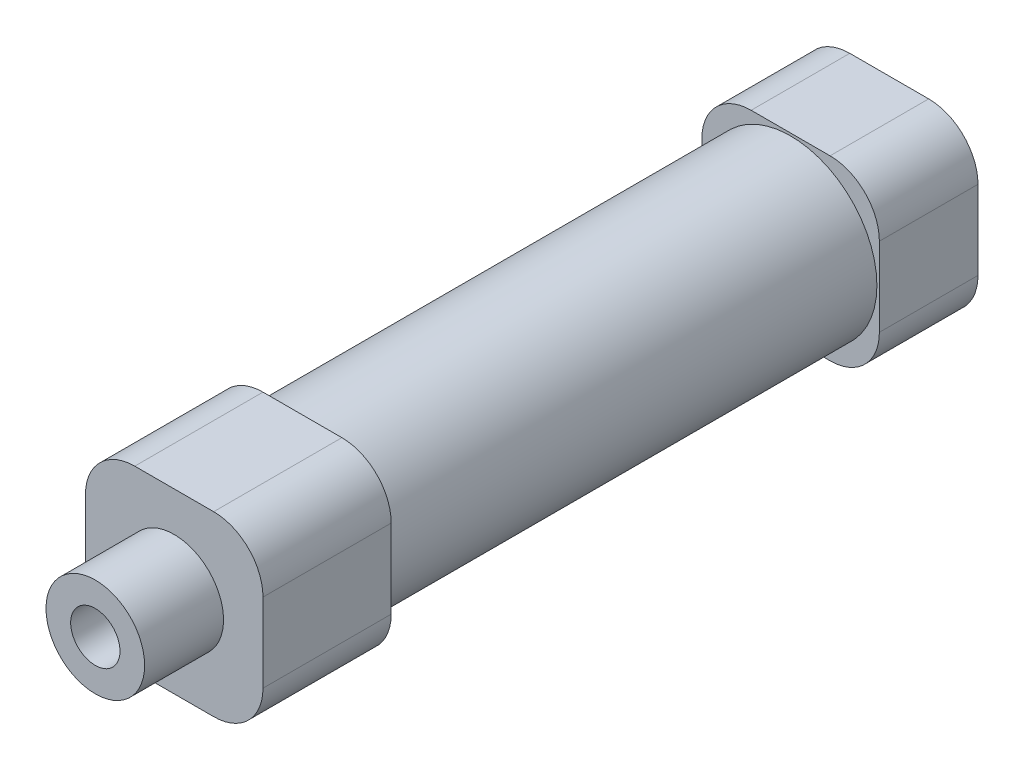
ISO-10303-21;
HEADER;
FILE_DESCRIPTION(('STEP AP214'),'2;1');
FILE_NAME('part.step','',(''),(''),'','','');
FILE_SCHEMA(('AUTOMOTIVE_DESIGN { 1 0 10303 214 1 1 1 1 }'));
ENDSEC;
DATA;
#1=APPLICATION_CONTEXT('core data for automotive mechanical design processes');
#2=APPLICATION_PROTOCOL_DEFINITION('international standard','automotive_design',2000,#1);
#3=PRODUCT_CONTEXT('',#1,'mechanical');
#4=PRODUCT('Part','Part','',(#3));
#5=PRODUCT_RELATED_PRODUCT_CATEGORY('part','',(#4));
#6=PRODUCT_DEFINITION_FORMATION('','',#4);
#7=PRODUCT_DEFINITION_CONTEXT('part definition',#1,'design');
#8=PRODUCT_DEFINITION('design','',#6,#7);
#9=PRODUCT_DEFINITION_SHAPE('','',#8);
#10=(LENGTH_UNIT() NAMED_UNIT(*) SI_UNIT(.MILLI.,.METRE.));
#11=(NAMED_UNIT(*) PLANE_ANGLE_UNIT() SI_UNIT($,.RADIAN.));
#12=(NAMED_UNIT(*) SI_UNIT($,.STERADIAN.) SOLID_ANGLE_UNIT());
#13=UNCERTAINTY_MEASURE_WITH_UNIT(LENGTH_MEASURE(1.E-05),#10,'distance_accuracy_value','');
#14=(GEOMETRIC_REPRESENTATION_CONTEXT(3) GLOBAL_UNCERTAINTY_ASSIGNED_CONTEXT((#13)) GLOBAL_UNIT_ASSIGNED_CONTEXT((#10,
#11,#12)) REPRESENTATION_CONTEXT('',''));
#15=CARTESIAN_POINT('',(0.,0.,0.));
#16=DIRECTION('',(0.,0.,1.));
#17=DIRECTION('',(1.,0.,0.));
#18=AXIS2_PLACEMENT_3D('',#15,#16,#17);
#19=CARTESIAN_POINT('',(0.,0.,72.5));
#20=DIRECTION('',(0.,0.,-1.));
#21=DIRECTION('',(-1.,0.,0.));
#22=AXIS2_PLACEMENT_3D('',#19,#20,#21);
#23=PLANE('',#22);
#24=DIRECTION('',(-1.,0.,0.));
#25=VECTOR('',#24,1.);
#26=CARTESIAN_POINT('',(-9.,9.,72.5));
#27=LINE('',#26,#25);
#28=CARTESIAN_POINT('',(4.,9.,72.5));
#29=VERTEX_POINT('',#28);
#30=CARTESIAN_POINT('',(-4.,9.,72.5));
#31=VERTEX_POINT('',#30);
#32=EDGE_CURVE('E191',#29,#31,#27,.T.);
#33=ORIENTED_EDGE('',*,*,#32,.T.);
#34=CARTESIAN_POINT('',(-4.,4.,72.5));
#35=DIRECTION('',(0.,0.,-1.));
#36=DIRECTION('',(-1.,0.,0.));
#37=AXIS2_PLACEMENT_3D('',#34,#35,#36);
#38=CIRCLE('',#37,5.);
#39=CARTESIAN_POINT('',(-9.,4.,72.5));
#40=VERTEX_POINT('',#39);
#41=EDGE_CURVE('E299',#31,#40,#38,.F.);
#42=ORIENTED_EDGE('',*,*,#41,.T.);
#43=DIRECTION('',(0.,-1.,0.));
#44=VECTOR('',#43,1.);
#45=CARTESIAN_POINT('',(-9.,-9.,72.5));
#46=LINE('',#45,#44);
#47=CARTESIAN_POINT('',(-9.,-4.,72.5));
#48=VERTEX_POINT('',#47);
#49=EDGE_CURVE('E195',#40,#48,#46,.T.);
#50=ORIENTED_EDGE('',*,*,#49,.T.);
#51=CARTESIAN_POINT('',(-4.,-4.,72.5));
#52=DIRECTION('',(0.,0.,-1.));
#53=DIRECTION('',(-1.,0.,0.));
#54=AXIS2_PLACEMENT_3D('',#51,#52,#53);
#55=CIRCLE('',#54,5.);
#56=CARTESIAN_POINT('',(-4.,-9.,72.5));
#57=VERTEX_POINT('',#56);
#58=EDGE_CURVE('E297',#48,#57,#55,.F.);
#59=ORIENTED_EDGE('',*,*,#58,.T.);
#60=DIRECTION('',(1.,0.,0.));
#61=VECTOR('',#60,1.);
#62=CARTESIAN_POINT('',(-9.,-9.,72.5));
#63=LINE('',#62,#61);
#64=CARTESIAN_POINT('',(4.,-9.,72.5));
#65=VERTEX_POINT('',#64);
#66=EDGE_CURVE('E198',#57,#65,#63,.T.);
#67=ORIENTED_EDGE('',*,*,#66,.T.);
#68=CARTESIAN_POINT('',(4.,-4.,72.5));
#69=DIRECTION('',(0.,0.,-1.));
#70=DIRECTION('',(-1.,0.,0.));
#71=AXIS2_PLACEMENT_3D('',#68,#69,#70);
#72=CIRCLE('',#71,5.);
#73=CARTESIAN_POINT('',(9.,-4.,72.5));
#74=VERTEX_POINT('',#73);
#75=EDGE_CURVE('E295',#65,#74,#72,.F.);
#76=ORIENTED_EDGE('',*,*,#75,.T.);
#77=DIRECTION('',(0.,1.,0.));
#78=VECTOR('',#77,1.);
#79=CARTESIAN_POINT('',(9.,-9.,72.5));
#80=LINE('',#79,#78);
#81=CARTESIAN_POINT('',(9.,4.,72.5));
#82=VERTEX_POINT('',#81);
#83=EDGE_CURVE('E188',#74,#82,#80,.T.);
#84=ORIENTED_EDGE('',*,*,#83,.T.);
#85=CARTESIAN_POINT('',(4.,4.,72.5));
#86=DIRECTION('',(0.,0.,-1.));
#87=DIRECTION('',(-1.,0.,0.));
#88=AXIS2_PLACEMENT_3D('',#85,#86,#87);
#89=CIRCLE('',#88,5.);
#90=EDGE_CURVE('E293',#82,#29,#89,.F.);
#91=ORIENTED_EDGE('',*,*,#90,.T.);
#92=EDGE_LOOP('',(#33,#42,#50,#59,#67,#76,#84,#91));
#93=FACE_BOUND('',#92,.T.);
#94=CARTESIAN_POINT('',(0.,0.,72.5));
#95=DIRECTION('',(0.,0.,-1.));
#96=DIRECTION('',(-1.,0.,0.));
#97=AXIS2_PLACEMENT_3D('',#94,#95,#96);
#98=CIRCLE('',#97,5.);
#99=CARTESIAN_POINT('',(-5.,0.,72.5));
#100=VERTEX_POINT('',#99);
#101=EDGE_CURVE('E231',#100,#100,#98,.F.);
#102=ORIENTED_EDGE('',*,*,#101,.F.);
#103=EDGE_LOOP('',(#102));
#104=FACE_BOUND('',#103,.T.);
#105=ADVANCED_FACE('F38',(#93,#104),#23,.F.);
#106=CARTESIAN_POINT('',(0.,0.,10.));
#107=DIRECTION('',(0.,0.,1.));
#108=DIRECTION('',(1.,0.,0.));
#109=AXIS2_PLACEMENT_3D('',#106,#107,#108);
#110=PLANE('',#109);
#111=DIRECTION('',(-1.,0.,0.));
#112=VECTOR('',#111,1.);
#113=CARTESIAN_POINT('',(-9.,9.,10.));
#114=LINE('',#113,#112);
#115=CARTESIAN_POINT('',(4.,9.,10.));
#116=VERTEX_POINT('',#115);
#117=CARTESIAN_POINT('',(-4.,9.,10.));
#118=VERTEX_POINT('',#117);
#119=EDGE_CURVE('E221',#116,#118,#114,.T.);
#120=ORIENTED_EDGE('',*,*,#119,.T.);
#121=CARTESIAN_POINT('',(-4.,4.,10.));
#122=DIRECTION('',(0.,0.,1.));
#123=DIRECTION('',(1.,0.,0.));
#124=AXIS2_PLACEMENT_3D('',#121,#122,#123);
#125=CIRCLE('',#124,5.);
#126=CARTESIAN_POINT('',(-9.,4.,10.));
#127=VERTEX_POINT('',#126);
#128=EDGE_CURVE('E268',#118,#127,#125,.T.);
#129=ORIENTED_EDGE('',*,*,#128,.T.);
#130=DIRECTION('',(0.,-1.,0.));
#131=VECTOR('',#130,1.);
#132=CARTESIAN_POINT('',(-9.,9.,10.));
#133=LINE('',#132,#131);
#134=CARTESIAN_POINT('',(-9.,-4.,10.));
#135=VERTEX_POINT('',#134);
#136=EDGE_CURVE('E225',#127,#135,#133,.T.);
#137=ORIENTED_EDGE('',*,*,#136,.T.);
#138=CARTESIAN_POINT('',(-4.,-4.,10.));
#139=DIRECTION('',(0.,0.,1.));
#140=DIRECTION('',(1.,0.,0.));
#141=AXIS2_PLACEMENT_3D('',#138,#139,#140);
#142=CIRCLE('',#141,5.);
#143=CARTESIAN_POINT('',(-4.,-9.,10.));
#144=VERTEX_POINT('',#143);
#145=EDGE_CURVE('E266',#135,#144,#142,.T.);
#146=ORIENTED_EDGE('',*,*,#145,.T.);
#147=DIRECTION('',(1.,0.,0.));
#148=VECTOR('',#147,1.);
#149=CARTESIAN_POINT('',(-9.,-9.,10.));
#150=LINE('',#149,#148);
#151=CARTESIAN_POINT('',(4.,-9.,10.));
#152=VERTEX_POINT('',#151);
#153=EDGE_CURVE('E228',#144,#152,#150,.T.);
#154=ORIENTED_EDGE('',*,*,#153,.T.);
#155=CARTESIAN_POINT('',(4.,-4.,10.));
#156=DIRECTION('',(0.,0.,1.));
#157=DIRECTION('',(1.,0.,0.));
#158=AXIS2_PLACEMENT_3D('',#155,#156,#157);
#159=CIRCLE('',#158,5.);
#160=CARTESIAN_POINT('',(9.,-4.,10.));
#161=VERTEX_POINT('',#160);
#162=EDGE_CURVE('E264',#152,#161,#159,.T.);
#163=ORIENTED_EDGE('',*,*,#162,.T.);
#164=DIRECTION('',(0.,1.,0.));
#165=VECTOR('',#164,1.);
#166=CARTESIAN_POINT('',(9.,9.,10.));
#167=LINE('',#166,#165);
#168=CARTESIAN_POINT('',(9.,4.,10.));
#169=VERTEX_POINT('',#168);
#170=EDGE_CURVE('E218',#161,#169,#167,.T.);
#171=ORIENTED_EDGE('',*,*,#170,.T.);
#172=CARTESIAN_POINT('',(4.,4.,10.));
#173=DIRECTION('',(0.,0.,1.));
#174=DIRECTION('',(1.,0.,0.));
#175=AXIS2_PLACEMENT_3D('',#172,#173,#174);
#176=CIRCLE('',#175,5.);
#177=EDGE_CURVE('E262',#169,#116,#176,.T.);
#178=ORIENTED_EDGE('',*,*,#177,.T.);
#179=EDGE_LOOP('',(#120,#129,#137,#146,#154,#163,#171,#178));
#180=FACE_BOUND('',#179,.T.);
#181=CARTESIAN_POINT('',(0.,0.,10.));
#182=DIRECTION('',(0.,0.,1.));
#183=DIRECTION('',(1.,0.,0.));
#184=AXIS2_PLACEMENT_3D('',#181,#182,#183);
#185=CIRCLE('',#184,8.75);
#186=CARTESIAN_POINT('',(8.74999999999999,0.,10.));
#187=VERTEX_POINT('',#186);
#188=EDGE_CURVE('E201',#187,#187,#185,.T.);
#189=ORIENTED_EDGE('',*,*,#188,.F.);
#190=EDGE_LOOP('',(#189));
#191=FACE_BOUND('',#190,.T.);
#192=ADVANCED_FACE('F369',(#180,#191),#110,.T.);
#193=CARTESIAN_POINT('',(9.,9.,10.));
#194=DIRECTION('',(-1.,0.,0.));
#195=DIRECTION('',(0.,-1.,0.));
#196=AXIS2_PLACEMENT_3D('',#193,#194,#195);
#197=PLANE('',#196);
#198=ORIENTED_EDGE('',*,*,#170,.F.);
#199=DIRECTION('',(0.,0.,-1.));
#200=VECTOR('',#199,1.);
#201=CARTESIAN_POINT('',(9.,-4.,10.));
#202=LINE('',#201,#200);
#203=CARTESIAN_POINT('',(9.,-4.,0.));
#204=VERTEX_POINT('',#203);
#205=EDGE_CURVE('E308',#161,#204,#202,.T.);
#206=ORIENTED_EDGE('',*,*,#205,.T.);
#207=DIRECTION('',(0.,1.,0.));
#208=VECTOR('',#207,1.);
#209=CARTESIAN_POINT('',(9.,9.,0.));
#210=LINE('',#209,#208);
#211=CARTESIAN_POINT('',(9.,4.,0.));
#212=VERTEX_POINT('',#211);
#213=EDGE_CURVE('E215',#204,#212,#210,.T.);
#214=ORIENTED_EDGE('',*,*,#213,.T.);
#215=DIRECTION('',(0.,0.,-1.));
#216=VECTOR('',#215,1.);
#217=CARTESIAN_POINT('',(9.,4.,10.));
#218=LINE('',#217,#216);
#219=EDGE_CURVE('E306',#212,#169,#218,.F.);
#220=ORIENTED_EDGE('',*,*,#219,.T.);
#221=EDGE_LOOP('',(#198,#206,#214,#220));
#222=FACE_BOUND('',#221,.T.);
#223=ADVANCED_FACE('F374',(#222),#197,.F.);
#224=CARTESIAN_POINT('',(-9.,9.,10.));
#225=DIRECTION('',(0.,-1.,0.));
#226=DIRECTION('',(0.,0.,-1.));
#227=AXIS2_PLACEMENT_3D('',#224,#225,#226);
#228=PLANE('',#227);
#229=DIRECTION('',(-1.,0.,0.));
#230=VECTOR('',#229,1.);
#231=CARTESIAN_POINT('',(-9.,9.,0.));
#232=LINE('',#231,#230);
#233=CARTESIAN_POINT('',(4.,9.,0.));
#234=VERTEX_POINT('',#233);
#235=CARTESIAN_POINT('',(-4.,9.,0.));
#236=VERTEX_POINT('',#235);
#237=EDGE_CURVE('E234',#234,#236,#232,.T.);
#238=ORIENTED_EDGE('',*,*,#237,.T.);
#239=DIRECTION('',(0.,0.,-1.));
#240=VECTOR('',#239,1.);
#241=CARTESIAN_POINT('',(-4.,9.,10.));
#242=LINE('',#241,#240);
#243=EDGE_CURVE('E260',#236,#118,#242,.F.);
#244=ORIENTED_EDGE('',*,*,#243,.T.);
#245=ORIENTED_EDGE('',*,*,#119,.F.);
#246=DIRECTION('',(0.,0.,-1.));
#247=VECTOR('',#246,1.);
#248=CARTESIAN_POINT('',(4.,9.,10.));
#249=LINE('',#248,#247);
#250=EDGE_CURVE('E257',#116,#234,#249,.T.);
#251=ORIENTED_EDGE('',*,*,#250,.T.);
#252=EDGE_LOOP('',(#238,#244,#245,#251));
#253=FACE_BOUND('',#252,.T.);
#254=ADVANCED_FACE('F407',(#253),#228,.F.);
#255=CARTESIAN_POINT('',(-9.,9.,10.));
#256=DIRECTION('',(1.,0.,0.));
#257=DIRECTION('',(0.,1.,0.));
#258=AXIS2_PLACEMENT_3D('',#255,#256,#257);
#259=PLANE('',#258);
#260=ORIENTED_EDGE('',*,*,#136,.F.);
#261=DIRECTION('',(0.,0.,-1.));
#262=VECTOR('',#261,1.);
#263=CARTESIAN_POINT('',(-9.,4.,10.));
#264=LINE('',#263,#262);
#265=CARTESIAN_POINT('',(-9.,4.,0.));
#266=VERTEX_POINT('',#265);
#267=EDGE_CURVE('E246',#127,#266,#264,.T.);
#268=ORIENTED_EDGE('',*,*,#267,.T.);
#269=DIRECTION('',(0.,-1.,0.));
#270=VECTOR('',#269,1.);
#271=CARTESIAN_POINT('',(-9.,9.,0.));
#272=LINE('',#271,#270);
#273=CARTESIAN_POINT('',(-9.,-4.,0.));
#274=VERTEX_POINT('',#273);
#275=EDGE_CURVE('E237',#266,#274,#272,.T.);
#276=ORIENTED_EDGE('',*,*,#275,.T.);
#277=DIRECTION('',(0.,0.,-1.));
#278=VECTOR('',#277,1.);
#279=CARTESIAN_POINT('',(-9.,-4.,10.));
#280=LINE('',#279,#278);
#281=EDGE_CURVE('E244',#274,#135,#280,.F.);
#282=ORIENTED_EDGE('',*,*,#281,.T.);
#283=EDGE_LOOP('',(#260,#268,#276,#282));
#284=FACE_BOUND('',#283,.T.);
#285=ADVANCED_FACE('F403',(#284),#259,.F.);
#286=CARTESIAN_POINT('',(-9.,-9.,10.));
#287=DIRECTION('',(0.,1.,0.));
#288=DIRECTION('',(0.,0.,1.));
#289=AXIS2_PLACEMENT_3D('',#286,#287,#288);
#290=PLANE('',#289);
#291=CARTESIAN_POINT('',(0.,-9.,5.25));
#292=DIRECTION('',(0.,-1.,0.));
#293=DIRECTION('',(0.,0.,-1.));
#294=AXIS2_PLACEMENT_3D('',#291,#292,#293);
#295=CIRCLE('',#294,2.5);
#296=CARTESIAN_POINT('',(0.,-9.,2.75));
#297=VERTEX_POINT('',#296);
#298=EDGE_CURVE('E176',#297,#297,#295,.T.);
#299=ORIENTED_EDGE('',*,*,#298,.F.);
#300=EDGE_LOOP('',(#299));
#301=FACE_BOUND('',#300,.T.);
#302=ORIENTED_EDGE('',*,*,#153,.F.);
#303=DIRECTION('',(0.,0.,-1.));
#304=VECTOR('',#303,1.);
#305=CARTESIAN_POINT('',(-4.,-9.,10.));
#306=LINE('',#305,#304);
#307=CARTESIAN_POINT('',(-4.,-9.,0.));
#308=VERTEX_POINT('',#307);
#309=EDGE_CURVE('E272',#144,#308,#306,.T.);
#310=ORIENTED_EDGE('',*,*,#309,.T.);
#311=DIRECTION('',(1.,0.,0.));
#312=VECTOR('',#311,1.);
#313=CARTESIAN_POINT('',(-9.,-9.,0.));
#314=LINE('',#313,#312);
#315=CARTESIAN_POINT('',(4.,-9.,0.));
#316=VERTEX_POINT('',#315);
#317=EDGE_CURVE('E222',#308,#316,#314,.T.);
#318=ORIENTED_EDGE('',*,*,#317,.T.);
#319=DIRECTION('',(0.,0.,-1.));
#320=VECTOR('',#319,1.);
#321=CARTESIAN_POINT('',(4.,-9.,10.));
#322=LINE('',#321,#320);
#323=EDGE_CURVE('E270',#316,#152,#322,.F.);
#324=ORIENTED_EDGE('',*,*,#323,.T.);
#325=EDGE_LOOP('',(#302,#310,#318,#324));
#326=FACE_BOUND('',#325,.T.);
#327=ADVANCED_FACE('F399',(#301,#326),#290,.F.);
#328=CARTESIAN_POINT('',(0.,0.,0.));
#329=DIRECTION('',(0.,0.,1.));
#330=DIRECTION('',(1.,0.,0.));
#331=AXIS2_PLACEMENT_3D('',#328,#329,#330);
#332=PLANE('',#331);
#333=ORIENTED_EDGE('',*,*,#275,.F.);
#334=CARTESIAN_POINT('',(-4.,4.,0.));
#335=DIRECTION('',(0.,0.,1.));
#336=DIRECTION('',(1.,0.,0.));
#337=AXIS2_PLACEMENT_3D('',#334,#335,#336);
#338=CIRCLE('',#337,5.);
#339=EDGE_CURVE('E255',#266,#236,#338,.F.);
#340=ORIENTED_EDGE('',*,*,#339,.T.);
#341=ORIENTED_EDGE('',*,*,#237,.F.);
#342=CARTESIAN_POINT('',(4.,4.,0.));
#343=DIRECTION('',(0.,0.,1.));
#344=DIRECTION('',(1.,0.,0.));
#345=AXIS2_PLACEMENT_3D('',#342,#343,#344);
#346=CIRCLE('',#345,5.);
#347=EDGE_CURVE('E249',#234,#212,#346,.F.);
#348=ORIENTED_EDGE('',*,*,#347,.T.);
#349=ORIENTED_EDGE('',*,*,#213,.F.);
#350=CARTESIAN_POINT('',(4.,-4.,0.));
#351=DIRECTION('',(0.,0.,1.));
#352=DIRECTION('',(1.,0.,0.));
#353=AXIS2_PLACEMENT_3D('',#350,#351,#352);
#354=CIRCLE('',#353,5.);
#355=EDGE_CURVE('E251',#204,#316,#354,.F.);
#356=ORIENTED_EDGE('',*,*,#355,.T.);
#357=ORIENTED_EDGE('',*,*,#317,.F.);
#358=CARTESIAN_POINT('',(-4.,-4.,0.));
#359=DIRECTION('',(0.,0.,1.));
#360=DIRECTION('',(1.,0.,0.));
#361=AXIS2_PLACEMENT_3D('',#358,#359,#360);
#362=CIRCLE('',#361,5.);
#363=EDGE_CURVE('E253',#308,#274,#362,.F.);
#364=ORIENTED_EDGE('',*,*,#363,.T.);
#365=EDGE_LOOP('',(#333,#340,#341,#348,#349,#356,#357,#364));
#366=FACE_BOUND('',#365,.T.);
#367=ADVANCED_FACE('F394',(#366),#332,.F.);
#368=CARTESIAN_POINT('',(0.,0.,59.5));
#369=DIRECTION('',(0.,0.,-1.));
#370=DIRECTION('',(-1.,0.,0.));
#371=AXIS2_PLACEMENT_3D('',#368,#369,#370);
#372=CYLINDRICAL_SURFACE('',#371,8.75);
#373=CARTESIAN_POINT('',(0.,0.,59.5));
#374=DIRECTION('',(0.,0.,1.));
#375=DIRECTION('',(1.,0.,0.));
#376=AXIS2_PLACEMENT_3D('',#373,#374,#375);
#377=CIRCLE('',#376,8.75);
#378=CARTESIAN_POINT('',(8.74999999999999,0.,59.5));
#379=VERTEX_POINT('',#378);
#380=EDGE_CURVE('E212',#379,#379,#377,.T.);
#381=ORIENTED_EDGE('',*,*,#380,.F.);
#382=EDGE_LOOP('',(#381));
#383=FACE_BOUND('',#382,.T.);
#384=ORIENTED_EDGE('',*,*,#188,.T.);
#385=EDGE_LOOP('',(#384));
#386=FACE_BOUND('',#385,.T.);
#387=ADVANCED_FACE('F383',(#383,#386),#372,.T.);
#388=CARTESIAN_POINT('',(0.,0.,59.5));
#389=DIRECTION('',(0.,0.,-1.));
#390=DIRECTION('',(-1.,0.,0.));
#391=AXIS2_PLACEMENT_3D('',#388,#389,#390);
#392=PLANE('',#391);
#393=DIRECTION('',(0.,-1.,0.));
#394=VECTOR('',#393,1.);
#395=CARTESIAN_POINT('',(-9.,-9.,59.5));
#396=LINE('',#395,#394);
#397=CARTESIAN_POINT('',(-9.,4.,59.5));
#398=VERTEX_POINT('',#397);
#399=CARTESIAN_POINT('',(-9.,-4.,59.5));
#400=VERTEX_POINT('',#399);
#401=EDGE_CURVE('E207',#398,#400,#396,.T.);
#402=ORIENTED_EDGE('',*,*,#401,.F.);
#403=CARTESIAN_POINT('',(-4.,4.,59.5));
#404=DIRECTION('',(0.,0.,-1.));
#405=DIRECTION('',(-1.,0.,0.));
#406=AXIS2_PLACEMENT_3D('',#403,#404,#405);
#407=CIRCLE('',#406,5.);
#408=CARTESIAN_POINT('',(-4.,9.,59.5));
#409=VERTEX_POINT('',#408);
#410=EDGE_CURVE('E286',#398,#409,#407,.T.);
#411=ORIENTED_EDGE('',*,*,#410,.T.);
#412=DIRECTION('',(-1.,0.,0.));
#413=VECTOR('',#412,1.);
#414=CARTESIAN_POINT('',(-9.,9.,59.5));
#415=LINE('',#414,#413);
#416=CARTESIAN_POINT('',(4.,9.,59.5));
#417=VERTEX_POINT('',#416);
#418=EDGE_CURVE('E204',#417,#409,#415,.T.);
#419=ORIENTED_EDGE('',*,*,#418,.F.);
#420=CARTESIAN_POINT('',(4.,4.,59.5));
#421=DIRECTION('',(0.,0.,-1.));
#422=DIRECTION('',(-1.,0.,0.));
#423=AXIS2_PLACEMENT_3D('',#420,#421,#422);
#424=CIRCLE('',#423,5.);
#425=CARTESIAN_POINT('',(9.,4.,59.5));
#426=VERTEX_POINT('',#425);
#427=EDGE_CURVE('E280',#417,#426,#424,.T.);
#428=ORIENTED_EDGE('',*,*,#427,.T.);
#429=DIRECTION('',(0.,1.,0.));
#430=VECTOR('',#429,1.);
#431=CARTESIAN_POINT('',(9.,-9.,59.5));
#432=LINE('',#431,#430);
#433=CARTESIAN_POINT('',(9.,-4.,59.5));
#434=VERTEX_POINT('',#433);
#435=EDGE_CURVE('E187',#434,#426,#432,.T.);
#436=ORIENTED_EDGE('',*,*,#435,.F.);
#437=CARTESIAN_POINT('',(4.,-4.,59.5));
#438=DIRECTION('',(0.,0.,-1.));
#439=DIRECTION('',(-1.,0.,0.));
#440=AXIS2_PLACEMENT_3D('',#437,#438,#439);
#441=CIRCLE('',#440,5.);
#442=CARTESIAN_POINT('',(4.,-9.,59.5));
#443=VERTEX_POINT('',#442);
#444=EDGE_CURVE('E282',#434,#443,#441,.T.);
#445=ORIENTED_EDGE('',*,*,#444,.T.);
#446=DIRECTION('',(1.,0.,0.));
#447=VECTOR('',#446,1.);
#448=CARTESIAN_POINT('',(-9.,-9.,59.5));
#449=LINE('',#448,#447);
#450=CARTESIAN_POINT('',(-4.,-9.,59.5));
#451=VERTEX_POINT('',#450);
#452=EDGE_CURVE('E192',#451,#443,#449,.T.);
#453=ORIENTED_EDGE('',*,*,#452,.F.);
#454=CARTESIAN_POINT('',(-4.,-4.,59.5));
#455=DIRECTION('',(0.,0.,-1.));
#456=DIRECTION('',(-1.,0.,0.));
#457=AXIS2_PLACEMENT_3D('',#454,#455,#456);
#458=CIRCLE('',#457,5.);
#459=EDGE_CURVE('E284',#451,#400,#458,.T.);
#460=ORIENTED_EDGE('',*,*,#459,.T.);
#461=EDGE_LOOP('',(#402,#411,#419,#428,#436,#445,#453,#460));
#462=FACE_BOUND('',#461,.T.);
#463=ORIENTED_EDGE('',*,*,#380,.T.);
#464=EDGE_LOOP('',(#463));
#465=FACE_BOUND('',#464,.T.);
#466=ADVANCED_FACE('F327',(#462,#465),#392,.T.);
#467=CARTESIAN_POINT('',(9.,-9.,72.5));
#468=DIRECTION('',(-1.,0.,0.));
#469=DIRECTION('',(0.,0.,1.));
#470=AXIS2_PLACEMENT_3D('',#467,#468,#469);
#471=PLANE('',#470);
#472=ORIENTED_EDGE('',*,*,#83,.F.);
#473=DIRECTION('',(0.,0.,-1.));
#474=VECTOR('',#473,1.);
#475=CARTESIAN_POINT('',(9.,-4.,72.5));
#476=LINE('',#475,#474);
#477=EDGE_CURVE('E313',#74,#434,#476,.T.);
#478=ORIENTED_EDGE('',*,*,#477,.T.);
#479=ORIENTED_EDGE('',*,*,#435,.T.);
#480=DIRECTION('',(0.,0.,-1.));
#481=VECTOR('',#480,1.);
#482=CARTESIAN_POINT('',(9.,4.,72.5));
#483=LINE('',#482,#481);
#484=EDGE_CURVE('E311',#426,#82,#483,.F.);
#485=ORIENTED_EDGE('',*,*,#484,.T.);
#486=EDGE_LOOP('',(#472,#478,#479,#485));
#487=FACE_BOUND('',#486,.T.);
#488=ADVANCED_FACE('F321',(#487),#471,.F.);
#489=CARTESIAN_POINT('',(-9.,9.,72.5));
#490=DIRECTION('',(0.,-1.,0.));
#491=DIRECTION('',(0.,0.,-1.));
#492=AXIS2_PLACEMENT_3D('',#489,#490,#491);
#493=PLANE('',#492);
#494=ORIENTED_EDGE('',*,*,#418,.T.);
#495=DIRECTION('',(0.,0.,-1.));
#496=VECTOR('',#495,1.);
#497=CARTESIAN_POINT('',(-4.,9.,72.5));
#498=LINE('',#497,#496);
#499=EDGE_CURVE('E291',#409,#31,#498,.F.);
#500=ORIENTED_EDGE('',*,*,#499,.T.);
#501=ORIENTED_EDGE('',*,*,#32,.F.);
#502=DIRECTION('',(0.,0.,-1.));
#503=VECTOR('',#502,1.);
#504=CARTESIAN_POINT('',(4.,9.,72.5));
#505=LINE('',#504,#503);
#506=EDGE_CURVE('E288',#29,#417,#505,.T.);
#507=ORIENTED_EDGE('',*,*,#506,.T.);
#508=EDGE_LOOP('',(#494,#500,#501,#507));
#509=FACE_BOUND('',#508,.T.);
#510=ADVANCED_FACE('F336',(#509),#493,.F.);
#511=CARTESIAN_POINT('',(-9.,-9.,72.5));
#512=DIRECTION('',(1.,0.,0.));
#513=DIRECTION('',(0.,0.,-1.));
#514=AXIS2_PLACEMENT_3D('',#511,#512,#513);
#515=PLANE('',#514);
#516=ORIENTED_EDGE('',*,*,#49,.F.);
#517=DIRECTION('',(0.,0.,-1.));
#518=VECTOR('',#517,1.);
#519=CARTESIAN_POINT('',(-9.,4.,72.5));
#520=LINE('',#519,#518);
#521=EDGE_CURVE('E277',#40,#398,#520,.T.);
#522=ORIENTED_EDGE('',*,*,#521,.T.);
#523=ORIENTED_EDGE('',*,*,#401,.T.);
#524=DIRECTION('',(0.,0.,-1.));
#525=VECTOR('',#524,1.);
#526=CARTESIAN_POINT('',(-9.,-4.,72.5));
#527=LINE('',#526,#525);
#528=EDGE_CURVE('E275',#400,#48,#527,.F.);
#529=ORIENTED_EDGE('',*,*,#528,.T.);
#530=EDGE_LOOP('',(#516,#522,#523,#529));
#531=FACE_BOUND('',#530,.T.);
#532=ADVANCED_FACE('F346',(#531),#515,.F.);
#533=CARTESIAN_POINT('',(-9.,-9.,72.5));
#534=DIRECTION('',(0.,1.,0.));
#535=DIRECTION('',(0.,0.,1.));
#536=AXIS2_PLACEMENT_3D('',#533,#534,#535);
#537=PLANE('',#536);
#538=CARTESIAN_POINT('',(0.,-9.,64.25));
#539=DIRECTION('',(0.,-1.,0.));
#540=DIRECTION('',(0.,0.,-1.));
#541=AXIS2_PLACEMENT_3D('',#538,#539,#540);
#542=CIRCLE('',#541,2.5);
#543=CARTESIAN_POINT('',(0.,-9.,61.75));
#544=VERTEX_POINT('',#543);
#545=EDGE_CURVE('E181',#544,#544,#542,.T.);
#546=ORIENTED_EDGE('',*,*,#545,.F.);
#547=EDGE_LOOP('',(#546));
#548=FACE_BOUND('',#547,.T.);
#549=ORIENTED_EDGE('',*,*,#66,.F.);
#550=DIRECTION('',(0.,0.,-1.));
#551=VECTOR('',#550,1.);
#552=CARTESIAN_POINT('',(-4.,-9.,72.5));
#553=LINE('',#552,#551);
#554=EDGE_CURVE('E303',#57,#451,#553,.T.);
#555=ORIENTED_EDGE('',*,*,#554,.T.);
#556=ORIENTED_EDGE('',*,*,#452,.T.);
#557=DIRECTION('',(0.,0.,-1.));
#558=VECTOR('',#557,1.);
#559=CARTESIAN_POINT('',(4.,-9.,72.5));
#560=LINE('',#559,#558);
#561=EDGE_CURVE('E301',#443,#65,#560,.F.);
#562=ORIENTED_EDGE('',*,*,#561,.T.);
#563=EDGE_LOOP('',(#549,#555,#556,#562));
#564=FACE_BOUND('',#563,.T.);
#565=ADVANCED_FACE('F354',(#548,#564),#537,.F.);
#566=CARTESIAN_POINT('',(0.,0.,80.5));
#567=DIRECTION('',(0.,0.,-1.));
#568=DIRECTION('',(-1.,0.,0.));
#569=AXIS2_PLACEMENT_3D('',#566,#567,#568);
#570=CYLINDRICAL_SURFACE('',#569,5.);
#571=CARTESIAN_POINT('',(0.,0.,80.5));
#572=DIRECTION('',(0.,0.,1.));
#573=DIRECTION('',(1.,0.,0.));
#574=AXIS2_PLACEMENT_3D('',#571,#572,#573);
#575=CIRCLE('',#574,5.);
#576=CARTESIAN_POINT('',(5.,0.,80.5));
#577=VERTEX_POINT('',#576);
#578=EDGE_CURVE('E178',#577,#577,#575,.T.);
#579=ORIENTED_EDGE('',*,*,#578,.F.);
#580=EDGE_LOOP('',(#579));
#581=FACE_BOUND('',#580,.T.);
#582=ORIENTED_EDGE('',*,*,#101,.T.);
#583=EDGE_LOOP('',(#582));
#584=FACE_BOUND('',#583,.T.);
#585=ADVANCED_FACE('F379',(#581,#584),#570,.T.);
#586=CARTESIAN_POINT('',(0.,0.,80.5));
#587=DIRECTION('',(0.,0.,1.));
#588=DIRECTION('',(1.,0.,0.));
#589=AXIS2_PLACEMENT_3D('',#586,#587,#588);
#590=PLANE('',#589);
#591=CARTESIAN_POINT('',(0.,0.,80.5));
#592=DIRECTION('',(0.,0.,1.));
#593=DIRECTION('',(1.,0.,0.));
#594=AXIS2_PLACEMENT_3D('',#591,#592,#593);
#595=CIRCLE('',#594,2.5);
#596=CARTESIAN_POINT('',(2.5,0.,80.5));
#597=VERTEX_POINT('',#596);
#598=EDGE_CURVE('E174',#597,#597,#595,.T.);
#599=ORIENTED_EDGE('',*,*,#598,.F.);
#600=EDGE_LOOP('',(#599));
#601=FACE_BOUND('',#600,.T.);
#602=ORIENTED_EDGE('',*,*,#578,.T.);
#603=EDGE_LOOP('',(#602));
#604=FACE_BOUND('',#603,.T.);
#605=ADVANCED_FACE('F164',(#601,#604),#590,.T.);
#606=CARTESIAN_POINT('',(0.,0.,-7.07106781186548));
#607=DIRECTION('',(0.,0.,1.));
#608=DIRECTION('',(1.,0.,0.));
#609=AXIS2_PLACEMENT_3D('',#606,#607,#608);
#610=CYLINDRICAL_SURFACE('',#609,2.5);
#611=CARTESIAN_POINT('',(0.,0.,64.25));
#612=DIRECTION('',(0.,0.707106781186548,0.707106781186547));
#613=DIRECTION('',(0.,-0.707106781186548,0.707106781186547));
#614=AXIS2_PLACEMENT_3D('',#611,#612,#613);
#615=ELLIPSE('',#614,3.53553390593274,2.5);
#616=CARTESIAN_POINT('',(2.5,0.,64.25));
#617=VERTEX_POINT('',#616);
#618=CARTESIAN_POINT('',(-2.5,0.,64.25));
#619=VERTEX_POINT('',#618);
#620=EDGE_CURVE('E46',#617,#619,#615,.F.);
#621=ORIENTED_EDGE('',*,*,#620,.T.);
#622=CARTESIAN_POINT('',(0.,0.,64.25));
#623=DIRECTION('',(0.,-0.707106781186548,0.707106781186547));
#624=DIRECTION('',(0.,0.707106781186548,0.707106781186547));
#625=AXIS2_PLACEMENT_3D('',#622,#623,#624);
#626=ELLIPSE('',#625,3.53553390593274,2.5);
#627=EDGE_CURVE('E12',#619,#617,#626,.T.);
#628=ORIENTED_EDGE('',*,*,#627,.T.);
#629=EDGE_LOOP('',(#621,#628));
#630=FACE_BOUND('',#629,.T.);
#631=CARTESIAN_POINT('',(0.,0.,5.25));
#632=DIRECTION('',(0.,0.707106781186548,0.707106781186547));
#633=DIRECTION('',(0.,-0.707106781186548,0.707106781186547));
#634=AXIS2_PLACEMENT_3D('',#631,#632,#633);
#635=ELLIPSE('',#634,3.53553390593274,2.5);
#636=CARTESIAN_POINT('',(2.49999999999999,0.,5.25));
#637=VERTEX_POINT('',#636);
#638=CARTESIAN_POINT('',(-2.50000000000001,0.,5.25));
#639=VERTEX_POINT('',#638);
#640=EDGE_CURVE('E167',#637,#639,#635,.F.);
#641=ORIENTED_EDGE('',*,*,#640,.T.);
#642=CARTESIAN_POINT('',(0.,0.,5.25));
#643=DIRECTION('',(0.,-0.707106781186548,0.707106781186547));
#644=DIRECTION('',(0.,0.707106781186548,0.707106781186547));
#645=AXIS2_PLACEMENT_3D('',#642,#643,#644);
#646=ELLIPSE('',#645,3.53553390593274,2.5);
#647=EDGE_CURVE('E57',#639,#637,#646,.T.);
#648=ORIENTED_EDGE('',*,*,#647,.T.);
#649=EDGE_LOOP('',(#641,#648));
#650=FACE_BOUND('',#649,.T.);
#651=CARTESIAN_POINT('',(0.,0.,1.));
#652=DIRECTION('',(0.,0.,1.));
#653=DIRECTION('',(1.,0.,0.));
#654=AXIS2_PLACEMENT_3D('',#651,#652,#653);
#655=CIRCLE('',#654,2.5);
#656=CARTESIAN_POINT('',(2.5,0.,1.));
#657=VERTEX_POINT('',#656);
#658=EDGE_CURVE('E171',#657,#657,#655,.F.);
#659=ORIENTED_EDGE('',*,*,#658,.T.);
#660=EDGE_LOOP('',(#659));
#661=FACE_BOUND('',#660,.T.);
#662=ORIENTED_EDGE('',*,*,#598,.T.);
#663=EDGE_LOOP('',(#662));
#664=FACE_BOUND('',#663,.T.);
#665=ADVANCED_FACE('F160',(#630,#650,#661,#664),#610,.F.);
#666=CARTESIAN_POINT('',(0.,0.,1.));
#667=DIRECTION('',(0.,0.,1.));
#668=DIRECTION('',(1.,0.,0.));
#669=AXIS2_PLACEMENT_3D('',#666,#667,#668);
#670=PLANE('',#669);
#671=ORIENTED_EDGE('',*,*,#658,.F.);
#672=EDGE_LOOP('',(#671));
#673=FACE_BOUND('',#672,.T.);
#674=ADVANCED_FACE('F163',(#673),#670,.T.);
#675=CARTESIAN_POINT('',(-4.,4.,10.));
#676=DIRECTION('',(0.,0.,-1.));
#677=DIRECTION('',(-1.,0.,0.));
#678=AXIS2_PLACEMENT_3D('',#675,#676,#677);
#679=CYLINDRICAL_SURFACE('',#678,5.);
#680=ORIENTED_EDGE('',*,*,#128,.F.);
#681=ORIENTED_EDGE('',*,*,#243,.F.);
#682=ORIENTED_EDGE('',*,*,#339,.F.);
#683=ORIENTED_EDGE('',*,*,#267,.F.);
#684=EDGE_LOOP('',(#680,#681,#682,#683));
#685=FACE_BOUND('',#684,.T.);
#686=ADVANCED_FACE('F415',(#685),#679,.T.);
#687=CARTESIAN_POINT('',(-4.,-4.,10.));
#688=DIRECTION('',(0.,0.,-1.));
#689=DIRECTION('',(-1.,0.,0.));
#690=AXIS2_PLACEMENT_3D('',#687,#688,#689);
#691=CYLINDRICAL_SURFACE('',#690,5.);
#692=ORIENTED_EDGE('',*,*,#145,.F.);
#693=ORIENTED_EDGE('',*,*,#281,.F.);
#694=ORIENTED_EDGE('',*,*,#363,.F.);
#695=ORIENTED_EDGE('',*,*,#309,.F.);
#696=EDGE_LOOP('',(#692,#693,#694,#695));
#697=FACE_BOUND('',#696,.T.);
#698=ADVANCED_FACE('F418',(#697),#691,.T.);
#699=CARTESIAN_POINT('',(-4.,4.,72.5));
#700=DIRECTION('',(0.,0.,-1.));
#701=DIRECTION('',(-1.,0.,0.));
#702=AXIS2_PLACEMENT_3D('',#699,#700,#701);
#703=CYLINDRICAL_SURFACE('',#702,5.);
#704=ORIENTED_EDGE('',*,*,#41,.F.);
#705=ORIENTED_EDGE('',*,*,#499,.F.);
#706=ORIENTED_EDGE('',*,*,#410,.F.);
#707=ORIENTED_EDGE('',*,*,#521,.F.);
#708=EDGE_LOOP('',(#704,#705,#706,#707));
#709=FACE_BOUND('',#708,.T.);
#710=ADVANCED_FACE('F344',(#709),#703,.T.);
#711=CARTESIAN_POINT('',(-4.,-4.,72.5));
#712=DIRECTION('',(0.,0.,-1.));
#713=DIRECTION('',(-1.,0.,0.));
#714=AXIS2_PLACEMENT_3D('',#711,#712,#713);
#715=CYLINDRICAL_SURFACE('',#714,5.);
#716=ORIENTED_EDGE('',*,*,#58,.F.);
#717=ORIENTED_EDGE('',*,*,#528,.F.);
#718=ORIENTED_EDGE('',*,*,#459,.F.);
#719=ORIENTED_EDGE('',*,*,#554,.F.);
#720=EDGE_LOOP('',(#716,#717,#718,#719));
#721=FACE_BOUND('',#720,.T.);
#722=ADVANCED_FACE('F351',(#721),#715,.T.);
#723=CARTESIAN_POINT('',(4.,-4.,10.));
#724=DIRECTION('',(0.,0.,-1.));
#725=DIRECTION('',(-1.,0.,0.));
#726=AXIS2_PLACEMENT_3D('',#723,#724,#725);
#727=CYLINDRICAL_SURFACE('',#726,5.);
#728=ORIENTED_EDGE('',*,*,#162,.F.);
#729=ORIENTED_EDGE('',*,*,#323,.F.);
#730=ORIENTED_EDGE('',*,*,#355,.F.);
#731=ORIENTED_EDGE('',*,*,#205,.F.);
#732=EDGE_LOOP('',(#728,#729,#730,#731));
#733=FACE_BOUND('',#732,.T.);
#734=ADVANCED_FACE('F359',(#733),#727,.T.);
#735=CARTESIAN_POINT('',(4.,-4.,72.5));
#736=DIRECTION('',(0.,0.,-1.));
#737=DIRECTION('',(-1.,0.,0.));
#738=AXIS2_PLACEMENT_3D('',#735,#736,#737);
#739=CYLINDRICAL_SURFACE('',#738,5.);
#740=ORIENTED_EDGE('',*,*,#75,.F.);
#741=ORIENTED_EDGE('',*,*,#561,.F.);
#742=ORIENTED_EDGE('',*,*,#444,.F.);
#743=ORIENTED_EDGE('',*,*,#477,.F.);
#744=EDGE_LOOP('',(#740,#741,#742,#743));
#745=FACE_BOUND('',#744,.T.);
#746=ADVANCED_FACE('F356',(#745),#739,.T.);
#747=CARTESIAN_POINT('',(4.,4.,10.));
#748=DIRECTION('',(0.,0.,-1.));
#749=DIRECTION('',(-1.,0.,0.));
#750=AXIS2_PLACEMENT_3D('',#747,#748,#749);
#751=CYLINDRICAL_SURFACE('',#750,5.);
#752=ORIENTED_EDGE('',*,*,#177,.F.);
#753=ORIENTED_EDGE('',*,*,#219,.F.);
#754=ORIENTED_EDGE('',*,*,#347,.F.);
#755=ORIENTED_EDGE('',*,*,#250,.F.);
#756=EDGE_LOOP('',(#752,#753,#754,#755));
#757=FACE_BOUND('',#756,.T.);
#758=ADVANCED_FACE('F358',(#757),#751,.T.);
#759=CARTESIAN_POINT('',(4.,4.,72.5));
#760=DIRECTION('',(0.,0.,-1.));
#761=DIRECTION('',(-1.,0.,0.));
#762=AXIS2_PLACEMENT_3D('',#759,#760,#761);
#763=CYLINDRICAL_SURFACE('',#762,5.);
#764=ORIENTED_EDGE('',*,*,#90,.F.);
#765=ORIENTED_EDGE('',*,*,#484,.F.);
#766=ORIENTED_EDGE('',*,*,#427,.F.);
#767=ORIENTED_EDGE('',*,*,#506,.F.);
#768=EDGE_LOOP('',(#764,#765,#766,#767));
#769=FACE_BOUND('',#768,.T.);
#770=ADVANCED_FACE('F40',(#769),#763,.T.);
#771=CARTESIAN_POINT('',(0.,7.07106781186549,5.25));
#772=DIRECTION('',(0.,-1.,0.));
#773=DIRECTION('',(0.,0.,-1.));
#774=AXIS2_PLACEMENT_3D('',#771,#772,#773);
#775=CYLINDRICAL_SURFACE('',#774,2.5);
#776=ORIENTED_EDGE('',*,*,#298,.T.);
#777=EDGE_LOOP('',(#776));
#778=FACE_BOUND('',#777,.T.);
#779=ORIENTED_EDGE('',*,*,#640,.F.);
#780=ORIENTED_EDGE('',*,*,#647,.F.);
#781=EDGE_LOOP('',(#779,#780));
#782=FACE_BOUND('',#781,.T.);
#783=ADVANCED_FACE('F453',(#778,#782),#775,.F.);
#784=CARTESIAN_POINT('',(0.,7.07106781186549,64.25));
#785=DIRECTION('',(0.,-1.,0.));
#786=DIRECTION('',(0.,0.,-1.));
#787=AXIS2_PLACEMENT_3D('',#784,#785,#786);
#788=CYLINDRICAL_SURFACE('',#787,2.5);
#789=ORIENTED_EDGE('',*,*,#545,.T.);
#790=EDGE_LOOP('',(#789));
#791=FACE_BOUND('',#790,.T.);
#792=ORIENTED_EDGE('',*,*,#620,.F.);
#793=ORIENTED_EDGE('',*,*,#627,.F.);
#794=EDGE_LOOP('',(#792,#793));
#795=FACE_BOUND('',#794,.T.);
#796=ADVANCED_FACE('F158',(#791,#795),#788,.F.);
#797=CLOSED_SHELL('',(#105,#192,#223,#254,#285,#327,#367,#387,#466,#488,#510,#532,#565,#585,
#605,#665,#674,#686,#698,#710,#722,#734,#746,#758,#770,#783,#796));
#798=MANIFOLD_SOLID_BREP('B2',#797);
#799=ADVANCED_BREP_SHAPE_REPRESENTATION('',(#18,#798),#14);
#800=SHAPE_DEFINITION_REPRESENTATION(#9,#799);
ENDSEC;
END-ISO-10303-21;
